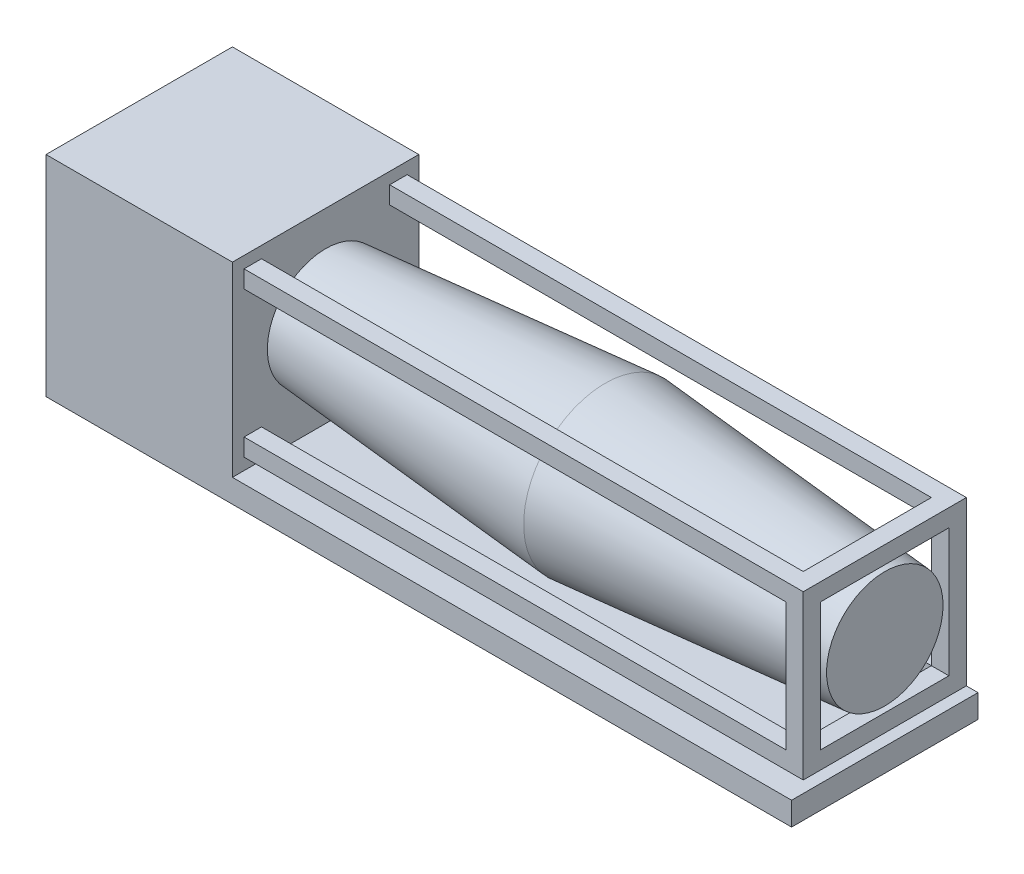
ISO-10303-21;
HEADER;
FILE_DESCRIPTION(('STEP AP214'),'2;1');
FILE_NAME('part.step','',(''),(''),'','','');
FILE_SCHEMA(('AUTOMOTIVE_DESIGN { 1 0 10303 214 1 1 1 1 }'));
ENDSEC;
DATA;
#1=APPLICATION_CONTEXT('core data for automotive mechanical design processes');
#2=APPLICATION_PROTOCOL_DEFINITION('international standard','automotive_design',2000,#1);
#3=PRODUCT_CONTEXT('',#1,'mechanical');
#4=PRODUCT('Part','Part','',(#3));
#5=PRODUCT_RELATED_PRODUCT_CATEGORY('part','',(#4));
#6=PRODUCT_DEFINITION_FORMATION('','',#4);
#7=PRODUCT_DEFINITION_CONTEXT('part definition',#1,'design');
#8=PRODUCT_DEFINITION('design','',#6,#7);
#9=PRODUCT_DEFINITION_SHAPE('','',#8);
#10=(LENGTH_UNIT() NAMED_UNIT(*) SI_UNIT(.MILLI.,.METRE.));
#11=(NAMED_UNIT(*) PLANE_ANGLE_UNIT() SI_UNIT($,.RADIAN.));
#12=(NAMED_UNIT(*) SI_UNIT($,.STERADIAN.) SOLID_ANGLE_UNIT());
#13=UNCERTAINTY_MEASURE_WITH_UNIT(LENGTH_MEASURE(1.E-05),#10,'distance_accuracy_value','');
#14=(GEOMETRIC_REPRESENTATION_CONTEXT(3) GLOBAL_UNCERTAINTY_ASSIGNED_CONTEXT((#13)) GLOBAL_UNIT_ASSIGNED_CONTEXT((#10,
#11,#12)) REPRESENTATION_CONTEXT('',''));
#15=CARTESIAN_POINT('',(0.,0.,0.));
#16=DIRECTION('',(0.,0.,1.));
#17=DIRECTION('',(1.,0.,0.));
#18=AXIS2_PLACEMENT_3D('',#15,#16,#17);
#19=CARTESIAN_POINT('',(661.213203435596,155.,-10.));
#20=DIRECTION('',(0.,1.,0.));
#21=DIRECTION('',(0.,0.,1.));
#22=AXIS2_PLACEMENT_3D('',#19,#20,#21);
#23=PLANE('',#22);
#24=DIRECTION('',(0.,0.,1.));
#25=VECTOR('',#24,1.);
#26=CARTESIAN_POINT('',(625.,155.,-135.));
#27=LINE('',#26,#25);
#28=CARTESIAN_POINT('',(625.,155.,-150.));
#29=VERTEX_POINT('',#28);
#30=CARTESIAN_POINT('',(625.,155.,-135.));
#31=VERTEX_POINT('',#30);
#32=EDGE_CURVE('E67',#29,#31,#27,.T.);
#33=ORIENTED_EDGE('',*,*,#32,.T.);
#34=DIRECTION('',(-1.,0.,0.));
#35=VECTOR('',#34,1.);
#36=CARTESIAN_POINT('',(661.213203435596,155.,-135.));
#37=LINE('',#36,#35);
#38=CARTESIAN_POINT('',(160.,155.,-135.));
#39=VERTEX_POINT('',#38);
#40=EDGE_CURVE('E364',#31,#39,#37,.T.);
#41=ORIENTED_EDGE('',*,*,#40,.T.);
#42=DIRECTION('',(0.,0.,-1.));
#43=VECTOR('',#42,1.);
#44=CARTESIAN_POINT('',(160.,155.,-150.));
#45=LINE('',#44,#43);
#46=CARTESIAN_POINT('',(160.,155.,-150.));
#47=VERTEX_POINT('',#46);
#48=EDGE_CURVE('E370',#39,#47,#45,.T.);
#49=ORIENTED_EDGE('',*,*,#48,.T.);
#50=DIRECTION('',(-1.,0.,0.));
#51=VECTOR('',#50,1.);
#52=CARTESIAN_POINT('',(661.213203435596,155.,-150.));
#53=LINE('',#52,#51);
#54=EDGE_CURVE('E367',#29,#47,#53,.T.);
#55=ORIENTED_EDGE('',*,*,#54,.F.);
#56=EDGE_LOOP('',(#33,#41,#49,#55));
#57=FACE_BOUND('',#56,.T.);
#58=ADVANCED_FACE('F43',(#57),#23,.F.);
#59=DIRECTION('',(1.,0.,0.));
#60=VECTOR('',#59,1.);
#61=CARTESIAN_POINT('',(625.,155.,-135.));
#62=LINE('',#61,#60);
#63=CARTESIAN_POINT('',(640.,155.,-135.));
#64=VERTEX_POINT('',#63);
#65=EDGE_CURVE('E247',#31,#64,#62,.T.);
#66=ORIENTED_EDGE('',*,*,#65,.T.);
#67=DIRECTION('',(0.,0.,1.));
#68=VECTOR('',#67,1.);
#69=CARTESIAN_POINT('',(640.,155.,-10.));
#70=LINE('',#69,#68);
#71=CARTESIAN_POINT('',(640.,155.,-25.));
#72=VERTEX_POINT('',#71);
#73=EDGE_CURVE('E394',#64,#72,#70,.T.);
#74=ORIENTED_EDGE('',*,*,#73,.T.);
#75=DIRECTION('',(-1.,0.,0.));
#76=VECTOR('',#75,1.);
#77=CARTESIAN_POINT('',(640.,155.,-25.));
#78=LINE('',#77,#76);
#79=CARTESIAN_POINT('',(625.,155.,-25.));
#80=VERTEX_POINT('',#79);
#81=EDGE_CURVE('E266',#72,#80,#78,.T.);
#82=ORIENTED_EDGE('',*,*,#81,.T.);
#83=DIRECTION('',(0.,0.,1.));
#84=VECTOR('',#83,1.);
#85=CARTESIAN_POINT('',(625.,155.,-156.213203435596));
#86=LINE('',#85,#84);
#87=EDGE_CURVE('E285',#31,#80,#86,.T.);
#88=ORIENTED_EDGE('',*,*,#87,.F.);
#89=EDGE_LOOP('',(#66,#74,#82,#88));
#90=FACE_BOUND('',#89,.T.);
#91=ADVANCED_FACE('F539',(#90),#23,.F.);
#92=CARTESIAN_POINT('',(661.213203435596,45.,-150.));
#93=DIRECTION('',(0.,-1.,0.));
#94=DIRECTION('',(0.,0.,-1.));
#95=AXIS2_PLACEMENT_3D('',#92,#93,#94);
#96=PLANE('',#95);
#97=DIRECTION('',(0.,0.,1.));
#98=VECTOR('',#97,1.);
#99=CARTESIAN_POINT('',(625.,45.,-135.));
#100=LINE('',#99,#98);
#101=CARTESIAN_POINT('',(625.,45.,-150.));
#102=VERTEX_POINT('',#101);
#103=CARTESIAN_POINT('',(625.,45.,-135.));
#104=VERTEX_POINT('',#103);
#105=EDGE_CURVE('E224',#102,#104,#100,.T.);
#106=ORIENTED_EDGE('',*,*,#105,.F.);
#107=DIRECTION('',(-1.,0.,0.));
#108=VECTOR('',#107,1.);
#109=CARTESIAN_POINT('',(661.213203435596,45.,-150.));
#110=LINE('',#109,#108);
#111=CARTESIAN_POINT('',(160.,45.,-150.));
#112=VERTEX_POINT('',#111);
#113=EDGE_CURVE('E207',#102,#112,#110,.T.);
#114=ORIENTED_EDGE('',*,*,#113,.T.);
#115=DIRECTION('',(0.,0.,1.));
#116=VECTOR('',#115,1.);
#117=CARTESIAN_POINT('',(160.,45.,-150.));
#118=LINE('',#117,#116);
#119=CARTESIAN_POINT('',(160.,45.,-135.));
#120=VERTEX_POINT('',#119);
#121=EDGE_CURVE('E343',#112,#120,#118,.T.);
#122=ORIENTED_EDGE('',*,*,#121,.T.);
#123=DIRECTION('',(-1.,0.,0.));
#124=VECTOR('',#123,1.);
#125=CARTESIAN_POINT('',(661.213203435596,45.,-135.));
#126=LINE('',#125,#124);
#127=EDGE_CURVE('E219',#104,#120,#126,.T.);
#128=ORIENTED_EDGE('',*,*,#127,.F.);
#129=EDGE_LOOP('',(#106,#114,#122,#128));
#130=FACE_BOUND('',#129,.T.);
#131=ADVANCED_FACE('F225',(#130),#96,.F.);
#132=DIRECTION('',(1.,0.,0.));
#133=VECTOR('',#132,1.);
#134=CARTESIAN_POINT('',(625.,45.,-135.));
#135=LINE('',#134,#133);
#136=CARTESIAN_POINT('',(640.,45.,-135.));
#137=VERTEX_POINT('',#136);
#138=EDGE_CURVE('E241',#104,#137,#135,.T.);
#139=ORIENTED_EDGE('',*,*,#138,.F.);
#140=DIRECTION('',(0.,0.,1.));
#141=VECTOR('',#140,1.);
#142=CARTESIAN_POINT('',(625.,45.,-156.213203435596));
#143=LINE('',#142,#141);
#144=CARTESIAN_POINT('',(625.,45.,-25.));
#145=VERTEX_POINT('',#144);
#146=EDGE_CURVE('E276',#104,#145,#143,.T.);
#147=ORIENTED_EDGE('',*,*,#146,.T.);
#148=DIRECTION('',(-1.,0.,0.));
#149=VECTOR('',#148,1.);
#150=CARTESIAN_POINT('',(640.,45.,-25.));
#151=LINE('',#150,#149);
#152=CARTESIAN_POINT('',(640.,45.,-25.));
#153=VERTEX_POINT('',#152);
#154=EDGE_CURVE('E235',#153,#145,#151,.T.);
#155=ORIENTED_EDGE('',*,*,#154,.F.);
#156=DIRECTION('',(0.,0.,-1.));
#157=VECTOR('',#156,1.);
#158=CARTESIAN_POINT('',(640.,45.,-150.));
#159=LINE('',#158,#157);
#160=EDGE_CURVE('E59',#153,#137,#159,.T.);
#161=ORIENTED_EDGE('',*,*,#160,.T.);
#162=EDGE_LOOP('',(#139,#147,#155,#161));
#163=FACE_BOUND('',#162,.T.);
#164=ADVANCED_FACE('F551',(#163),#96,.F.);
#165=DIRECTION('',(0.,0.,1.));
#166=VECTOR('',#165,1.);
#167=CARTESIAN_POINT('',(625.,155.,-10.));
#168=LINE('',#167,#166);
#169=CARTESIAN_POINT('',(625.,155.,-10.));
#170=VERTEX_POINT('',#169);
#171=EDGE_CURVE('E262',#80,#170,#168,.T.);
#172=ORIENTED_EDGE('',*,*,#171,.T.);
#173=DIRECTION('',(-1.,0.,0.));
#174=VECTOR('',#173,1.);
#175=CARTESIAN_POINT('',(661.213203435596,155.,-10.));
#176=LINE('',#175,#174);
#177=CARTESIAN_POINT('',(160.,155.,-10.));
#178=VERTEX_POINT('',#177);
#179=EDGE_CURVE('E416',#170,#178,#176,.T.);
#180=ORIENTED_EDGE('',*,*,#179,.T.);
#181=DIRECTION('',(0.,0.,-1.));
#182=VECTOR('',#181,1.);
#183=CARTESIAN_POINT('',(160.,155.,-10.));
#184=LINE('',#183,#182);
#185=CARTESIAN_POINT('',(160.,155.,-25.));
#186=VERTEX_POINT('',#185);
#187=EDGE_CURVE('E409',#178,#186,#184,.T.);
#188=ORIENTED_EDGE('',*,*,#187,.T.);
#189=DIRECTION('',(-1.,0.,0.));
#190=VECTOR('',#189,1.);
#191=CARTESIAN_POINT('',(661.213203435596,155.,-25.));
#192=LINE('',#191,#190);
#193=EDGE_CURVE('E413',#80,#186,#192,.T.);
#194=ORIENTED_EDGE('',*,*,#193,.F.);
#195=EDGE_LOOP('',(#172,#180,#188,#194));
#196=FACE_BOUND('',#195,.T.);
#197=ADVANCED_FACE('F542',(#196),#23,.F.);
#198=DIRECTION('',(0.,0.,1.));
#199=VECTOR('',#198,1.);
#200=CARTESIAN_POINT('',(625.,45.,-10.));
#201=LINE('',#200,#199);
#202=CARTESIAN_POINT('',(625.,45.,-10.));
#203=VERTEX_POINT('',#202);
#204=EDGE_CURVE('E254',#145,#203,#201,.T.);
#205=ORIENTED_EDGE('',*,*,#204,.F.);
#206=DIRECTION('',(-1.,0.,0.));
#207=VECTOR('',#206,1.);
#208=CARTESIAN_POINT('',(661.213203435596,45.,-25.));
#209=LINE('',#208,#207);
#210=CARTESIAN_POINT('',(160.,45.,-25.));
#211=VERTEX_POINT('',#210);
#212=EDGE_CURVE('E309',#145,#211,#209,.T.);
#213=ORIENTED_EDGE('',*,*,#212,.T.);
#214=DIRECTION('',(0.,0.,1.));
#215=VECTOR('',#214,1.);
#216=CARTESIAN_POINT('',(160.,45.,-10.));
#217=LINE('',#216,#215);
#218=CARTESIAN_POINT('',(160.,45.,-10.));
#219=VERTEX_POINT('',#218);
#220=EDGE_CURVE('E315',#211,#219,#217,.T.);
#221=ORIENTED_EDGE('',*,*,#220,.T.);
#222=DIRECTION('',(-1.,0.,0.));
#223=VECTOR('',#222,1.);
#224=CARTESIAN_POINT('',(661.213203435596,45.,-10.));
#225=LINE('',#224,#223);
#226=EDGE_CURVE('E312',#203,#219,#225,.T.);
#227=ORIENTED_EDGE('',*,*,#226,.F.);
#228=EDGE_LOOP('',(#205,#213,#221,#227));
#229=FACE_BOUND('',#228,.T.);
#230=ADVANCED_FACE('F550',(#229),#96,.F.);
#231=CARTESIAN_POINT('',(661.213203435596,170.,-25.));
#232=DIRECTION('',(0.,0.,1.));
#233=DIRECTION('',(0.,-1.,0.));
#234=AXIS2_PLACEMENT_3D('',#231,#232,#233);
#235=PLANE('',#234);
#236=DIRECTION('',(0.,1.,0.));
#237=VECTOR('',#236,1.);
#238=CARTESIAN_POINT('',(625.,170.,-25.));
#239=LINE('',#238,#237);
#240=CARTESIAN_POINT('',(625.,170.,-25.));
#241=VERTEX_POINT('',#240);
#242=EDGE_CURVE('E289',#80,#241,#239,.T.);
#243=ORIENTED_EDGE('',*,*,#242,.F.);
#244=ORIENTED_EDGE('',*,*,#193,.T.);
#245=DIRECTION('',(0.,1.,0.));
#246=VECTOR('',#245,1.);
#247=CARTESIAN_POINT('',(160.,170.,-25.));
#248=LINE('',#247,#246);
#249=CARTESIAN_POINT('',(160.,170.,-25.));
#250=VERTEX_POINT('',#249);
#251=EDGE_CURVE('E386',#186,#250,#248,.T.);
#252=ORIENTED_EDGE('',*,*,#251,.T.);
#253=DIRECTION('',(-1.,0.,0.));
#254=VECTOR('',#253,1.);
#255=CARTESIAN_POINT('',(661.213203435596,170.,-25.));
#256=LINE('',#255,#254);
#257=EDGE_CURVE('E422',#241,#250,#256,.T.);
#258=ORIENTED_EDGE('',*,*,#257,.F.);
#259=EDGE_LOOP('',(#243,#244,#252,#258));
#260=FACE_BOUND('',#259,.T.);
#261=ADVANCED_FACE('F557',(#260),#235,.F.);
#262=CARTESIAN_POINT('',(661.213203435596,170.,-135.));
#263=DIRECTION('',(0.,0.,-1.));
#264=DIRECTION('',(-1.,0.,0.));
#265=AXIS2_PLACEMENT_3D('',#262,#263,#264);
#266=PLANE('',#265);
#267=DIRECTION('',(0.,1.,0.));
#268=VECTOR('',#267,1.);
#269=CARTESIAN_POINT('',(625.,170.,-135.));
#270=LINE('',#269,#268);
#271=CARTESIAN_POINT('',(625.,170.,-135.));
#272=VERTEX_POINT('',#271);
#273=EDGE_CURVE('E294',#31,#272,#270,.T.);
#274=ORIENTED_EDGE('',*,*,#273,.T.);
#275=DIRECTION('',(-1.,0.,0.));
#276=VECTOR('',#275,1.);
#277=CARTESIAN_POINT('',(661.213203435596,170.,-135.));
#278=LINE('',#277,#276);
#279=CARTESIAN_POINT('',(160.,170.,-135.));
#280=VERTEX_POINT('',#279);
#281=EDGE_CURVE('E361',#272,#280,#278,.T.);
#282=ORIENTED_EDGE('',*,*,#281,.T.);
#283=DIRECTION('',(0.,-1.,0.));
#284=VECTOR('',#283,1.);
#285=CARTESIAN_POINT('',(160.,170.,-135.));
#286=LINE('',#285,#284);
#287=EDGE_CURVE('E374',#280,#39,#286,.T.);
#288=ORIENTED_EDGE('',*,*,#287,.T.);
#289=ORIENTED_EDGE('',*,*,#40,.F.);
#290=EDGE_LOOP('',(#274,#282,#288,#289));
#291=FACE_BOUND('',#290,.T.);
#292=ADVANCED_FACE('F624',(#291),#266,.F.);
#293=CARTESIAN_POINT('',(160.,0.,0.));
#294=DIRECTION('',(1.,0.,0.));
#295=DIRECTION('',(0.,0.,-1.));
#296=AXIS2_PLACEMENT_3D('',#293,#294,#295);
#297=PLANE('',#296);
#298=DIRECTION('',(0.,-1.,0.));
#299=VECTOR('',#298,1.);
#300=CARTESIAN_POINT('',(160.,180.,0.));
#301=LINE('',#300,#299);
#302=CARTESIAN_POINT('',(160.,180.,0.));
#303=VERTEX_POINT('',#302);
#304=CARTESIAN_POINT('',(160.,20.,0.));
#305=VERTEX_POINT('',#304);
#306=EDGE_CURVE('E439',#303,#305,#301,.T.);
#307=ORIENTED_EDGE('',*,*,#306,.T.);
#308=DIRECTION('',(0.,0.,-1.));
#309=VECTOR('',#308,1.);
#310=CARTESIAN_POINT('',(160.,20.,0.));
#311=LINE('',#310,#309);
#312=CARTESIAN_POINT('',(160.,20.,-160.));
#313=VERTEX_POINT('',#312);
#314=EDGE_CURVE('E443',#305,#313,#311,.T.);
#315=ORIENTED_EDGE('',*,*,#314,.T.);
#316=DIRECTION('',(0.,1.,0.));
#317=VECTOR('',#316,1.);
#318=CARTESIAN_POINT('',(160.,180.,-160.));
#319=LINE('',#318,#317);
#320=CARTESIAN_POINT('',(160.,180.,-160.));
#321=VERTEX_POINT('',#320);
#322=EDGE_CURVE('E447',#313,#321,#319,.T.);
#323=ORIENTED_EDGE('',*,*,#322,.T.);
#324=DIRECTION('',(0.,0.,1.));
#325=VECTOR('',#324,1.);
#326=CARTESIAN_POINT('',(160.,180.,0.));
#327=LINE('',#326,#325);
#328=EDGE_CURVE('E450',#321,#303,#327,.T.);
#329=ORIENTED_EDGE('',*,*,#328,.T.);
#330=EDGE_LOOP('',(#307,#315,#323,#329));
#331=FACE_BOUND('',#330,.T.);
#332=CARTESIAN_POINT('',(160.,100.,-80.));
#333=DIRECTION('',(1.,0.,0.));
#334=DIRECTION('',(0.,0.,-1.));
#335=AXIS2_PLACEMENT_3D('',#332,#333,#334);
#336=CIRCLE('',#335,50.);
#337=CARTESIAN_POINT('',(160.,100.,-130.));
#338=VERTEX_POINT('',#337);
#339=EDGE_CURVE('E434',#338,#338,#336,.T.);
#340=ORIENTED_EDGE('',*,*,#339,.F.);
#341=EDGE_LOOP('',(#340));
#342=FACE_BOUND('',#341,.T.);
#343=ORIENTED_EDGE('',*,*,#251,.F.);
#344=ORIENTED_EDGE('',*,*,#187,.F.);
#345=DIRECTION('',(0.,-1.,0.));
#346=VECTOR('',#345,1.);
#347=CARTESIAN_POINT('',(160.,170.,-10.));
#348=LINE('',#347,#346);
#349=CARTESIAN_POINT('',(160.,170.,-10.));
#350=VERTEX_POINT('',#349);
#351=EDGE_CURVE('E405',#350,#178,#348,.T.);
#352=ORIENTED_EDGE('',*,*,#351,.F.);
#353=DIRECTION('',(0.,0.,1.));
#354=VECTOR('',#353,1.);
#355=CARTESIAN_POINT('',(160.,170.,-10.));
#356=LINE('',#355,#354);
#357=EDGE_CURVE('E401',#250,#350,#356,.T.);
#358=ORIENTED_EDGE('',*,*,#357,.F.);
#359=EDGE_LOOP('',(#343,#344,#352,#358));
#360=FACE_BOUND('',#359,.T.);
#361=DIRECTION('',(0.,1.,0.));
#362=VECTOR('',#361,1.);
#363=CARTESIAN_POINT('',(160.,170.,-150.));
#364=LINE('',#363,#362);
#365=CARTESIAN_POINT('',(160.,170.,-150.));
#366=VERTEX_POINT('',#365);
#367=EDGE_CURVE('E382',#47,#366,#364,.T.);
#368=ORIENTED_EDGE('',*,*,#367,.F.);
#369=ORIENTED_EDGE('',*,*,#48,.F.);
#370=ORIENTED_EDGE('',*,*,#287,.F.);
#371=DIRECTION('',(0.,0.,1.));
#372=VECTOR('',#371,1.);
#373=CARTESIAN_POINT('',(160.,170.,-150.));
#374=LINE('',#373,#372);
#375=EDGE_CURVE('E378',#366,#280,#374,.T.);
#376=ORIENTED_EDGE('',*,*,#375,.F.);
#377=EDGE_LOOP('',(#368,#369,#370,#376));
#378=FACE_BOUND('',#377,.T.);
#379=DIRECTION('',(0.,0.,-1.));
#380=VECTOR('',#379,1.);
#381=CARTESIAN_POINT('',(160.,30.,-150.));
#382=LINE('',#381,#380);
#383=CARTESIAN_POINT('',(160.,30.,-135.));
#384=VERTEX_POINT('',#383);
#385=CARTESIAN_POINT('',(160.,30.,-150.));
#386=VERTEX_POINT('',#385);
#387=EDGE_CURVE('E348',#384,#386,#382,.T.);
#388=ORIENTED_EDGE('',*,*,#387,.F.);
#389=DIRECTION('',(0.,-1.,0.));
#390=VECTOR('',#389,1.);
#391=CARTESIAN_POINT('',(160.,30.,-135.));
#392=LINE('',#391,#390);
#393=EDGE_CURVE('E339',#120,#384,#392,.T.);
#394=ORIENTED_EDGE('',*,*,#393,.F.);
#395=ORIENTED_EDGE('',*,*,#121,.F.);
#396=DIRECTION('',(0.,1.,0.));
#397=VECTOR('',#396,1.);
#398=CARTESIAN_POINT('',(160.,30.,-150.));
#399=LINE('',#398,#397);
#400=EDGE_CURVE('E214',#386,#112,#399,.T.);
#401=ORIENTED_EDGE('',*,*,#400,.F.);
#402=EDGE_LOOP('',(#388,#394,#395,#401));
#403=FACE_BOUND('',#402,.T.);
#404=DIRECTION('',(0.,-1.,0.));
#405=VECTOR('',#404,1.);
#406=CARTESIAN_POINT('',(160.,30.,-10.));
#407=LINE('',#406,#405);
#408=CARTESIAN_POINT('',(160.,30.,-10.));
#409=VERTEX_POINT('',#408);
#410=EDGE_CURVE('E327',#219,#409,#407,.T.);
#411=ORIENTED_EDGE('',*,*,#410,.F.);
#412=ORIENTED_EDGE('',*,*,#220,.F.);
#413=DIRECTION('',(0.,1.,0.));
#414=VECTOR('',#413,1.);
#415=CARTESIAN_POINT('',(160.,30.,-25.));
#416=LINE('',#415,#414);
#417=CARTESIAN_POINT('',(160.,30.,-25.));
#418=VERTEX_POINT('',#417);
#419=EDGE_CURVE('E319',#418,#211,#416,.T.);
#420=ORIENTED_EDGE('',*,*,#419,.F.);
#421=DIRECTION('',(0.,0.,-1.));
#422=VECTOR('',#421,1.);
#423=CARTESIAN_POINT('',(160.,30.,-10.));
#424=LINE('',#423,#422);
#425=EDGE_CURVE('E323',#409,#418,#424,.T.);
#426=ORIENTED_EDGE('',*,*,#425,.F.);
#427=EDGE_LOOP('',(#411,#412,#420,#426));
#428=FACE_BOUND('',#427,.T.);
#429=ADVANCED_FACE('F520',(#331,#342,#360,#378,#403,#428),#297,.T.);
#430=CARTESIAN_POINT('',(0.,180.,0.));
#431=DIRECTION('',(0.,-1.,0.));
#432=DIRECTION('',(0.,0.,-1.));
#433=AXIS2_PLACEMENT_3D('',#430,#431,#432);
#434=PLANE('',#433);
#435=ORIENTED_EDGE('',*,*,#328,.F.);
#436=DIRECTION('',(-1.,0.,0.));
#437=VECTOR('',#436,1.);
#438=CARTESIAN_POINT('',(0.,180.,-160.));
#439=LINE('',#438,#437);
#440=CARTESIAN_POINT('',(0.,180.,-160.));
#441=VERTEX_POINT('',#440);
#442=EDGE_CURVE('E472',#321,#441,#439,.T.);
#443=ORIENTED_EDGE('',*,*,#442,.T.);
#444=DIRECTION('',(0.,0.,1.));
#445=VECTOR('',#444,1.);
#446=CARTESIAN_POINT('',(0.,180.,0.));
#447=LINE('',#446,#445);
#448=CARTESIAN_POINT('',(0.,180.,0.));
#449=VERTEX_POINT('',#448);
#450=EDGE_CURVE('E463',#441,#449,#447,.T.);
#451=ORIENTED_EDGE('',*,*,#450,.T.);
#452=DIRECTION('',(1.,0.,0.));
#453=VECTOR('',#452,1.);
#454=CARTESIAN_POINT('',(0.,180.,0.));
#455=LINE('',#454,#453);
#456=EDGE_CURVE('E467',#449,#303,#455,.T.);
#457=ORIENTED_EDGE('',*,*,#456,.T.);
#458=EDGE_LOOP('',(#435,#443,#451,#457));
#459=FACE_BOUND('',#458,.T.);
#460=ADVANCED_FACE('F518',(#459),#434,.F.);
#461=CARTESIAN_POINT('',(0.,180.,0.));
#462=DIRECTION('',(1.,0.,0.));
#463=DIRECTION('',(0.,0.,-1.));
#464=AXIS2_PLACEMENT_3D('',#461,#462,#463);
#465=PLANE('',#464);
#466=DIRECTION('',(0.,0.,1.));
#467=VECTOR('',#466,1.);
#468=CARTESIAN_POINT('',(0.,0.,0.));
#469=LINE('',#468,#467);
#470=CARTESIAN_POINT('',(0.,0.,-160.));
#471=VERTEX_POINT('',#470);
#472=CARTESIAN_POINT('',(0.,0.,0.));
#473=VERTEX_POINT('',#472);
#474=EDGE_CURVE('E460',#471,#473,#469,.T.);
#475=ORIENTED_EDGE('',*,*,#474,.T.);
#476=DIRECTION('',(0.,-1.,0.));
#477=VECTOR('',#476,1.);
#478=CARTESIAN_POINT('',(0.,180.,0.));
#479=LINE('',#478,#477);
#480=EDGE_CURVE('E11',#449,#473,#479,.T.);
#481=ORIENTED_EDGE('',*,*,#480,.F.);
#482=ORIENTED_EDGE('',*,*,#450,.F.);
#483=DIRECTION('',(0.,-1.,0.));
#484=VECTOR('',#483,1.);
#485=CARTESIAN_POINT('',(0.,180.,-160.));
#486=LINE('',#485,#484);
#487=EDGE_CURVE('E475',#441,#471,#486,.T.);
#488=ORIENTED_EDGE('',*,*,#487,.T.);
#489=EDGE_LOOP('',(#475,#481,#482,#488));
#490=FACE_BOUND('',#489,.T.);
#491=ADVANCED_FACE('F45',(#490),#465,.F.);
#492=CARTESIAN_POINT('',(0.,180.,0.));
#493=DIRECTION('',(0.,0.,-1.));
#494=DIRECTION('',(-1.,0.,0.));
#495=AXIS2_PLACEMENT_3D('',#492,#493,#494);
#496=PLANE('',#495);
#497=DIRECTION('',(0.,-1.,0.));
#498=VECTOR('',#497,1.);
#499=CARTESIAN_POINT('',(640.,180.,0.));
#500=LINE('',#499,#498);
#501=CARTESIAN_POINT('',(640.,20.,0.));
#502=VERTEX_POINT('',#501);
#503=CARTESIAN_POINT('',(640.,0.,0.));
#504=VERTEX_POINT('',#503);
#505=EDGE_CURVE('E52',#502,#504,#500,.T.);
#506=ORIENTED_EDGE('',*,*,#505,.F.);
#507=DIRECTION('',(1.,0.,0.));
#508=VECTOR('',#507,1.);
#509=CARTESIAN_POINT('',(160.,20.,0.));
#510=LINE('',#509,#508);
#511=EDGE_CURVE('E453',#305,#502,#510,.T.);
#512=ORIENTED_EDGE('',*,*,#511,.F.);
#513=ORIENTED_EDGE('',*,*,#306,.F.);
#514=ORIENTED_EDGE('',*,*,#456,.F.);
#515=ORIENTED_EDGE('',*,*,#480,.T.);
#516=DIRECTION('',(1.,0.,0.));
#517=VECTOR('',#516,1.);
#518=CARTESIAN_POINT('',(0.,0.,0.));
#519=LINE('',#518,#517);
#520=EDGE_CURVE('E479',#473,#504,#519,.T.);
#521=ORIENTED_EDGE('',*,*,#520,.T.);
#522=EDGE_LOOP('',(#506,#512,#513,#514,#515,#521));
#523=FACE_BOUND('',#522,.T.);
#524=ADVANCED_FACE('F504',(#523),#496,.F.);
#525=CARTESIAN_POINT('',(640.,180.,0.));
#526=DIRECTION('',(-1.,0.,0.));
#527=DIRECTION('',(0.,0.,1.));
#528=AXIS2_PLACEMENT_3D('',#525,#526,#527);
#529=PLANE('',#528);
#530=DIRECTION('',(0.,-1.,0.));
#531=VECTOR('',#530,1.);
#532=CARTESIAN_POINT('',(640.,180.,-160.));
#533=LINE('',#532,#531);
#534=CARTESIAN_POINT('',(640.,20.,-160.));
#535=VERTEX_POINT('',#534);
#536=CARTESIAN_POINT('',(640.,0.,-160.));
#537=VERTEX_POINT('',#536);
#538=EDGE_CURVE('E492',#535,#537,#533,.T.);
#539=ORIENTED_EDGE('',*,*,#538,.F.);
#540=DIRECTION('',(0.,0.,-1.));
#541=VECTOR('',#540,1.);
#542=CARTESIAN_POINT('',(640.,20.,0.));
#543=LINE('',#542,#541);
#544=EDGE_CURVE('E438',#502,#535,#543,.T.);
#545=ORIENTED_EDGE('',*,*,#544,.F.);
#546=ORIENTED_EDGE('',*,*,#505,.T.);
#547=DIRECTION('',(0.,0.,-1.));
#548=VECTOR('',#547,1.);
#549=CARTESIAN_POINT('',(640.,0.,0.));
#550=LINE('',#549,#548);
#551=EDGE_CURVE('E483',#504,#537,#550,.T.);
#552=ORIENTED_EDGE('',*,*,#551,.T.);
#553=EDGE_LOOP('',(#539,#545,#546,#552));
#554=FACE_BOUND('',#553,.T.);
#555=ADVANCED_FACE('F499',(#554),#529,.F.);
#556=CARTESIAN_POINT('',(0.,180.,-160.));
#557=DIRECTION('',(0.,0.,1.));
#558=DIRECTION('',(1.,0.,0.));
#559=AXIS2_PLACEMENT_3D('',#556,#557,#558);
#560=PLANE('',#559);
#561=ORIENTED_EDGE('',*,*,#322,.F.);
#562=DIRECTION('',(1.,0.,0.));
#563=VECTOR('',#562,1.);
#564=CARTESIAN_POINT('',(160.,20.,-160.));
#565=LINE('',#564,#563);
#566=EDGE_CURVE('E456',#313,#535,#565,.T.);
#567=ORIENTED_EDGE('',*,*,#566,.T.);
#568=ORIENTED_EDGE('',*,*,#538,.T.);
#569=DIRECTION('',(-1.,0.,0.));
#570=VECTOR('',#569,1.);
#571=CARTESIAN_POINT('',(0.,0.,-160.));
#572=LINE('',#571,#570);
#573=EDGE_CURVE('E468',#537,#471,#572,.T.);
#574=ORIENTED_EDGE('',*,*,#573,.T.);
#575=ORIENTED_EDGE('',*,*,#487,.F.);
#576=ORIENTED_EDGE('',*,*,#442,.F.);
#577=EDGE_LOOP('',(#561,#567,#568,#574,#575,#576));
#578=FACE_BOUND('',#577,.T.);
#579=ADVANCED_FACE('F512',(#578),#560,.F.);
#580=CARTESIAN_POINT('',(0.,0.,0.));
#581=DIRECTION('',(0.,-1.,0.));
#582=DIRECTION('',(0.,0.,-1.));
#583=AXIS2_PLACEMENT_3D('',#580,#581,#582);
#584=PLANE('',#583);
#585=ORIENTED_EDGE('',*,*,#474,.F.);
#586=ORIENTED_EDGE('',*,*,#573,.F.);
#587=ORIENTED_EDGE('',*,*,#551,.F.);
#588=ORIENTED_EDGE('',*,*,#520,.F.);
#589=EDGE_LOOP('',(#585,#586,#587,#588));
#590=FACE_BOUND('',#589,.T.);
#591=ADVANCED_FACE('F508',(#590),#584,.T.);
#592=CARTESIAN_POINT('',(160.,20.,0.));
#593=DIRECTION('',(0.,-1.,0.));
#594=DIRECTION('',(0.,0.,-1.));
#595=AXIS2_PLACEMENT_3D('',#592,#593,#594);
#596=PLANE('',#595);
#597=ORIENTED_EDGE('',*,*,#544,.T.);
#598=ORIENTED_EDGE('',*,*,#566,.F.);
#599=ORIENTED_EDGE('',*,*,#314,.F.);
#600=ORIENTED_EDGE('',*,*,#511,.T.);
#601=EDGE_LOOP('',(#597,#598,#599,#600));
#602=FACE_BOUND('',#601,.T.);
#603=ADVANCED_FACE('F524',(#602),#596,.F.);
#604=CARTESIAN_POINT('',(160.,100.,-80.));
#605=DIRECTION('',(1.,0.,0.));
#606=DIRECTION('',(0.,0.,-1.));
#607=AXIS2_PLACEMENT_3D('',#604,#605,#606);
#608=CONICAL_SURFACE('',#607,50.,0.0831412318884412);
#609=CARTESIAN_POINT('',(400.,100.,-80.));
#610=DIRECTION('',(1.,0.,0.));
#611=DIRECTION('',(0.,0.,-1.));
#612=AXIS2_PLACEMENT_3D('',#609,#610,#611);
#613=CIRCLE('',#612,70.);
#614=CARTESIAN_POINT('',(400.,100.,-150.));
#615=VERTEX_POINT('',#614);
#616=EDGE_CURVE('E397',#615,#615,#613,.T.);
#617=ORIENTED_EDGE('',*,*,#616,.F.);
#618=EDGE_LOOP('',(#617));
#619=FACE_BOUND('',#618,.T.);
#620=ORIENTED_EDGE('',*,*,#339,.T.);
#621=EDGE_LOOP('',(#620));
#622=FACE_BOUND('',#621,.T.);
#623=ADVANCED_FACE('F526',(#619,#622),#608,.T.);
#624=CARTESIAN_POINT('',(640.,100.,-80.));
#625=DIRECTION('',(-1.,0.,0.));
#626=DIRECTION('',(0.,0.,1.));
#627=AXIS2_PLACEMENT_3D('',#624,#625,#626);
#628=CONICAL_SURFACE('',#627,50.,0.0831412318884412);
#629=ORIENTED_EDGE('',*,*,#616,.T.);
#630=EDGE_LOOP('',(#629));
#631=FACE_BOUND('',#630,.T.);
#632=CARTESIAN_POINT('',(640.,100.,-80.));
#633=DIRECTION('',(1.,0.,0.));
#634=DIRECTION('',(0.,0.,-1.));
#635=AXIS2_PLACEMENT_3D('',#632,#633,#634);
#636=CIRCLE('',#635,50.);
#637=CARTESIAN_POINT('',(640.,100.,-130.));
#638=VERTEX_POINT('',#637);
#639=EDGE_CURVE('E430',#638,#638,#636,.T.);
#640=ORIENTED_EDGE('',*,*,#639,.F.);
#641=EDGE_LOOP('',(#640));
#642=FACE_BOUND('',#641,.T.);
#643=ADVANCED_FACE('F532',(#631,#642),#628,.T.);
#644=CARTESIAN_POINT('',(640.,180.,0.));
#645=DIRECTION('',(-1.,0.,0.));
#646=DIRECTION('',(0.,0.,1.));
#647=AXIS2_PLACEMENT_3D('',#644,#645,#646);
#648=PLANE('',#647);
#649=ORIENTED_EDGE('',*,*,#639,.T.);
#650=EDGE_LOOP('',(#649));
#651=FACE_BOUND('',#650,.T.);
#652=ADVANCED_FACE('F649',(#651),#648,.F.);
#653=CARTESIAN_POINT('',(661.213203435596,170.,-10.));
#654=DIRECTION('',(0.,0.,-1.));
#655=DIRECTION('',(0.,1.,0.));
#656=AXIS2_PLACEMENT_3D('',#653,#654,#655);
#657=PLANE('',#656);
#658=ORIENTED_EDGE('',*,*,#179,.F.);
#659=DIRECTION('',(0.,-1.,0.));
#660=VECTOR('',#659,1.);
#661=CARTESIAN_POINT('',(625.,176.213203435596,-10.));
#662=LINE('',#661,#660);
#663=EDGE_CURVE('E257',#170,#203,#662,.T.);
#664=ORIENTED_EDGE('',*,*,#663,.T.);
#665=ORIENTED_EDGE('',*,*,#226,.T.);
#666=ORIENTED_EDGE('',*,*,#410,.T.);
#667=DIRECTION('',(-1.,0.,0.));
#668=VECTOR('',#667,1.);
#669=CARTESIAN_POINT('',(661.213203435596,30.,-10.));
#670=LINE('',#669,#668);
#671=CARTESIAN_POINT('',(640.,30.,-10.));
#672=VERTEX_POINT('',#671);
#673=EDGE_CURVE('E297',#672,#409,#670,.T.);
#674=ORIENTED_EDGE('',*,*,#673,.F.);
#675=DIRECTION('',(0.,1.,0.));
#676=VECTOR('',#675,1.);
#677=CARTESIAN_POINT('',(640.,170.,-10.));
#678=LINE('',#677,#676);
#679=CARTESIAN_POINT('',(640.,170.,-10.));
#680=VERTEX_POINT('',#679);
#681=EDGE_CURVE('E389',#672,#680,#678,.T.);
#682=ORIENTED_EDGE('',*,*,#681,.T.);
#683=DIRECTION('',(-1.,0.,0.));
#684=VECTOR('',#683,1.);
#685=CARTESIAN_POINT('',(661.213203435596,170.,-10.));
#686=LINE('',#685,#684);
#687=EDGE_CURVE('E419',#680,#350,#686,.T.);
#688=ORIENTED_EDGE('',*,*,#687,.T.);
#689=ORIENTED_EDGE('',*,*,#351,.T.);
#690=EDGE_LOOP('',(#658,#664,#665,#666,#674,#682,#688,#689));
#691=FACE_BOUND('',#690,.T.);
#692=ADVANCED_FACE('F567',(#691),#657,.F.);
#693=CARTESIAN_POINT('',(661.213203435596,170.,-10.));
#694=DIRECTION('',(0.,-1.,0.));
#695=DIRECTION('',(0.,0.,-1.));
#696=AXIS2_PLACEMENT_3D('',#693,#694,#695);
#697=PLANE('',#696);
#698=ORIENTED_EDGE('',*,*,#687,.F.);
#699=DIRECTION('',(0.,0.,-1.));
#700=VECTOR('',#699,1.);
#701=CARTESIAN_POINT('',(640.,170.,-10.));
#702=LINE('',#701,#700);
#703=CARTESIAN_POINT('',(640.,170.,-150.));
#704=VERTEX_POINT('',#703);
#705=EDGE_CURVE('E393',#680,#704,#702,.T.);
#706=ORIENTED_EDGE('',*,*,#705,.T.);
#707=DIRECTION('',(-1.,0.,0.));
#708=VECTOR('',#707,1.);
#709=CARTESIAN_POINT('',(661.213203435596,170.,-150.));
#710=LINE('',#709,#708);
#711=EDGE_CURVE('E358',#704,#366,#710,.T.);
#712=ORIENTED_EDGE('',*,*,#711,.T.);
#713=ORIENTED_EDGE('',*,*,#375,.T.);
#714=ORIENTED_EDGE('',*,*,#281,.F.);
#715=DIRECTION('',(0.,0.,1.));
#716=VECTOR('',#715,1.);
#717=CARTESIAN_POINT('',(625.,170.,-156.213203435596));
#718=LINE('',#717,#716);
#719=EDGE_CURVE('E293',#272,#241,#718,.T.);
#720=ORIENTED_EDGE('',*,*,#719,.T.);
#721=ORIENTED_EDGE('',*,*,#257,.T.);
#722=ORIENTED_EDGE('',*,*,#357,.T.);
#723=EDGE_LOOP('',(#698,#706,#712,#713,#714,#720,#721,#722));
#724=FACE_BOUND('',#723,.T.);
#725=ADVANCED_FACE('F601',(#724),#697,.F.);
#726=CARTESIAN_POINT('',(640.,180.,0.));
#727=DIRECTION('',(-1.,0.,0.));
#728=DIRECTION('',(0.,0.,1.));
#729=AXIS2_PLACEMENT_3D('',#726,#727,#728);
#730=PLANE('',#729);
#731=DIRECTION('',(0.,0.,1.));
#732=VECTOR('',#731,1.);
#733=CARTESIAN_POINT('',(640.,30.,-150.));
#734=LINE('',#733,#732);
#735=CARTESIAN_POINT('',(640.,30.,-150.));
#736=VERTEX_POINT('',#735);
#737=EDGE_CURVE('E331',#736,#672,#734,.T.);
#738=ORIENTED_EDGE('',*,*,#737,.F.);
#739=DIRECTION('',(0.,-1.,0.));
#740=VECTOR('',#739,1.);
#741=CARTESIAN_POINT('',(640.,170.,-150.));
#742=LINE('',#741,#740);
#743=EDGE_CURVE('E352',#704,#736,#742,.T.);
#744=ORIENTED_EDGE('',*,*,#743,.F.);
#745=ORIENTED_EDGE('',*,*,#705,.F.);
#746=ORIENTED_EDGE('',*,*,#681,.F.);
#747=EDGE_LOOP('',(#738,#744,#745,#746));
#748=FACE_BOUND('',#747,.T.);
#749=DIRECTION('',(0.,-1.,0.));
#750=VECTOR('',#749,1.);
#751=CARTESIAN_POINT('',(640.,176.213203435596,-135.));
#752=LINE('',#751,#750);
#753=EDGE_CURVE('E238',#64,#137,#752,.T.);
#754=ORIENTED_EDGE('',*,*,#753,.T.);
#755=ORIENTED_EDGE('',*,*,#160,.F.);
#756=DIRECTION('',(0.,-1.,0.));
#757=VECTOR('',#756,1.);
#758=CARTESIAN_POINT('',(640.,176.213203435596,-25.));
#759=LINE('',#758,#757);
#760=EDGE_CURVE('E232',#72,#153,#759,.T.);
#761=ORIENTED_EDGE('',*,*,#760,.F.);
#762=ORIENTED_EDGE('',*,*,#73,.F.);
#763=EDGE_LOOP('',(#754,#755,#761,#762));
#764=FACE_BOUND('',#763,.T.);
#765=ADVANCED_FACE('F594',(#748,#764),#730,.F.);
#766=CARTESIAN_POINT('',(661.213203435596,170.,-150.));
#767=DIRECTION('',(0.,0.,1.));
#768=DIRECTION('',(1.,0.,0.));
#769=AXIS2_PLACEMENT_3D('',#766,#767,#768);
#770=PLANE('',#769);
#771=ORIENTED_EDGE('',*,*,#711,.F.);
#772=ORIENTED_EDGE('',*,*,#743,.T.);
#773=DIRECTION('',(-1.,0.,0.));
#774=VECTOR('',#773,1.);
#775=CARTESIAN_POINT('',(661.213203435596,30.,-150.));
#776=LINE('',#775,#774);
#777=EDGE_CURVE('E220',#736,#386,#776,.T.);
#778=ORIENTED_EDGE('',*,*,#777,.T.);
#779=ORIENTED_EDGE('',*,*,#400,.T.);
#780=ORIENTED_EDGE('',*,*,#113,.F.);
#781=DIRECTION('',(0.,-1.,0.));
#782=VECTOR('',#781,1.);
#783=CARTESIAN_POINT('',(625.,176.213203435596,-150.));
#784=LINE('',#783,#782);
#785=EDGE_CURVE('E211',#29,#102,#784,.T.);
#786=ORIENTED_EDGE('',*,*,#785,.F.);
#787=ORIENTED_EDGE('',*,*,#54,.T.);
#788=ORIENTED_EDGE('',*,*,#367,.T.);
#789=EDGE_LOOP('',(#771,#772,#778,#779,#780,#786,#787,#788));
#790=FACE_BOUND('',#789,.T.);
#791=ADVANCED_FACE('F210',(#790),#770,.F.);
#792=CARTESIAN_POINT('',(661.213203435596,30.,-135.));
#793=DIRECTION('',(0.,0.,-1.));
#794=DIRECTION('',(-1.,0.,0.));
#795=AXIS2_PLACEMENT_3D('',#792,#793,#794);
#796=PLANE('',#795);
#797=DIRECTION('',(-1.,0.,0.));
#798=VECTOR('',#797,1.);
#799=CARTESIAN_POINT('',(661.213203435596,30.,-135.));
#800=LINE('',#799,#798);
#801=CARTESIAN_POINT('',(625.,30.,-135.));
#802=VERTEX_POINT('',#801);
#803=EDGE_CURVE('E336',#802,#384,#800,.T.);
#804=ORIENTED_EDGE('',*,*,#803,.F.);
#805=DIRECTION('',(0.,-1.,0.));
#806=VECTOR('',#805,1.);
#807=CARTESIAN_POINT('',(625.,30.,-135.));
#808=LINE('',#807,#806);
#809=EDGE_CURVE('E277',#104,#802,#808,.T.);
#810=ORIENTED_EDGE('',*,*,#809,.F.);
#811=ORIENTED_EDGE('',*,*,#127,.T.);
#812=ORIENTED_EDGE('',*,*,#393,.T.);
#813=EDGE_LOOP('',(#804,#810,#811,#812));
#814=FACE_BOUND('',#813,.T.);
#815=ADVANCED_FACE('F630',(#814),#796,.F.);
#816=CARTESIAN_POINT('',(661.213203435596,30.,-150.));
#817=DIRECTION('',(0.,1.,0.));
#818=DIRECTION('',(0.,0.,1.));
#819=AXIS2_PLACEMENT_3D('',#816,#817,#818);
#820=PLANE('',#819);
#821=ORIENTED_EDGE('',*,*,#777,.F.);
#822=ORIENTED_EDGE('',*,*,#737,.T.);
#823=ORIENTED_EDGE('',*,*,#673,.T.);
#824=ORIENTED_EDGE('',*,*,#425,.T.);
#825=DIRECTION('',(-1.,0.,0.));
#826=VECTOR('',#825,1.);
#827=CARTESIAN_POINT('',(661.213203435596,30.,-25.));
#828=LINE('',#827,#826);
#829=CARTESIAN_POINT('',(625.,30.,-25.));
#830=VERTEX_POINT('',#829);
#831=EDGE_CURVE('E306',#830,#418,#828,.T.);
#832=ORIENTED_EDGE('',*,*,#831,.F.);
#833=DIRECTION('',(0.,0.,1.));
#834=VECTOR('',#833,1.);
#835=CARTESIAN_POINT('',(625.,30.,-156.213203435596));
#836=LINE('',#835,#834);
#837=EDGE_CURVE('E281',#802,#830,#836,.T.);
#838=ORIENTED_EDGE('',*,*,#837,.F.);
#839=ORIENTED_EDGE('',*,*,#803,.T.);
#840=ORIENTED_EDGE('',*,*,#387,.T.);
#841=EDGE_LOOP('',(#821,#822,#823,#824,#832,#838,#839,#840));
#842=FACE_BOUND('',#841,.T.);
#843=ADVANCED_FACE('F586',(#842),#820,.F.);
#844=CARTESIAN_POINT('',(661.213203435596,30.,-25.));
#845=DIRECTION('',(0.,0.,1.));
#846=DIRECTION('',(0.,-1.,0.));
#847=AXIS2_PLACEMENT_3D('',#844,#845,#846);
#848=PLANE('',#847);
#849=ORIENTED_EDGE('',*,*,#212,.F.);
#850=DIRECTION('',(0.,-1.,0.));
#851=VECTOR('',#850,1.);
#852=CARTESIAN_POINT('',(625.,30.,-25.));
#853=LINE('',#852,#851);
#854=EDGE_CURVE('E265',#145,#830,#853,.T.);
#855=ORIENTED_EDGE('',*,*,#854,.T.);
#856=ORIENTED_EDGE('',*,*,#831,.T.);
#857=ORIENTED_EDGE('',*,*,#419,.T.);
#858=EDGE_LOOP('',(#849,#855,#856,#857));
#859=FACE_BOUND('',#858,.T.);
#860=ADVANCED_FACE('F575',(#859),#848,.F.);
#861=CARTESIAN_POINT('',(625.,170.,-156.213203435596));
#862=DIRECTION('',(1.,0.,0.));
#863=DIRECTION('',(0.,0.,-1.));
#864=AXIS2_PLACEMENT_3D('',#861,#862,#863);
#865=PLANE('',#864);
#866=ORIENTED_EDGE('',*,*,#273,.F.);
#867=ORIENTED_EDGE('',*,*,#87,.T.);
#868=ORIENTED_EDGE('',*,*,#242,.T.);
#869=ORIENTED_EDGE('',*,*,#719,.F.);
#870=EDGE_LOOP('',(#866,#867,#868,#869));
#871=FACE_BOUND('',#870,.T.);
#872=ADVANCED_FACE('F613',(#871),#865,.F.);
#873=CARTESIAN_POINT('',(625.,30.,-156.213203435596));
#874=DIRECTION('',(-1.,0.,0.));
#875=DIRECTION('',(0.,0.,1.));
#876=AXIS2_PLACEMENT_3D('',#873,#874,#875);
#877=PLANE('',#876);
#878=ORIENTED_EDGE('',*,*,#146,.F.);
#879=ORIENTED_EDGE('',*,*,#809,.T.);
#880=ORIENTED_EDGE('',*,*,#837,.T.);
#881=ORIENTED_EDGE('',*,*,#854,.F.);
#882=EDGE_LOOP('',(#878,#879,#880,#881));
#883=FACE_BOUND('',#882,.T.);
#884=ADVANCED_FACE('F582',(#883),#877,.T.);
#885=CARTESIAN_POINT('',(640.,176.213203435596,-25.));
#886=DIRECTION('',(0.,0.,1.));
#887=DIRECTION('',(1.,0.,0.));
#888=AXIS2_PLACEMENT_3D('',#885,#886,#887);
#889=PLANE('',#888);
#890=ORIENTED_EDGE('',*,*,#81,.F.);
#891=ORIENTED_EDGE('',*,*,#760,.T.);
#892=ORIENTED_EDGE('',*,*,#154,.T.);
#893=DIRECTION('',(0.,-1.,0.));
#894=VECTOR('',#893,1.);
#895=CARTESIAN_POINT('',(625.,176.213203435596,-25.));
#896=LINE('',#895,#894);
#897=EDGE_CURVE('E258',#80,#145,#896,.T.);
#898=ORIENTED_EDGE('',*,*,#897,.F.);
#899=EDGE_LOOP('',(#890,#891,#892,#898));
#900=FACE_BOUND('',#899,.T.);
#901=ADVANCED_FACE('F619',(#900),#889,.F.);
#902=CARTESIAN_POINT('',(625.,176.213203435596,-10.));
#903=DIRECTION('',(1.,0.,0.));
#904=DIRECTION('',(0.,0.,-1.));
#905=AXIS2_PLACEMENT_3D('',#902,#903,#904);
#906=PLANE('',#905);
#907=ORIENTED_EDGE('',*,*,#171,.F.);
#908=ORIENTED_EDGE('',*,*,#897,.T.);
#909=ORIENTED_EDGE('',*,*,#204,.T.);
#910=ORIENTED_EDGE('',*,*,#663,.F.);
#911=EDGE_LOOP('',(#907,#908,#909,#910));
#912=FACE_BOUND('',#911,.T.);
#913=ADVANCED_FACE('F571',(#912),#906,.F.);
#914=CARTESIAN_POINT('',(625.,176.213203435596,-135.));
#915=DIRECTION('',(1.,0.,0.));
#916=DIRECTION('',(0.,0.,-1.));
#917=AXIS2_PLACEMENT_3D('',#914,#915,#916);
#918=PLANE('',#917);
#919=ORIENTED_EDGE('',*,*,#32,.F.);
#920=ORIENTED_EDGE('',*,*,#785,.T.);
#921=ORIENTED_EDGE('',*,*,#105,.T.);
#922=DIRECTION('',(0.,-1.,0.));
#923=VECTOR('',#922,1.);
#924=CARTESIAN_POINT('',(625.,176.213203435596,-135.));
#925=LINE('',#924,#923);
#926=EDGE_CURVE('E228',#31,#104,#925,.T.);
#927=ORIENTED_EDGE('',*,*,#926,.F.);
#928=EDGE_LOOP('',(#919,#920,#921,#927));
#929=FACE_BOUND('',#928,.T.);
#930=ADVANCED_FACE('F230',(#929),#918,.F.);
#931=CARTESIAN_POINT('',(625.,176.213203435596,-135.));
#932=DIRECTION('',(0.,0.,-1.));
#933=DIRECTION('',(-1.,0.,0.));
#934=AXIS2_PLACEMENT_3D('',#931,#932,#933);
#935=PLANE('',#934);
#936=ORIENTED_EDGE('',*,*,#65,.F.);
#937=ORIENTED_EDGE('',*,*,#926,.T.);
#938=ORIENTED_EDGE('',*,*,#138,.T.);
#939=ORIENTED_EDGE('',*,*,#753,.F.);
#940=EDGE_LOOP('',(#936,#937,#938,#939));
#941=FACE_BOUND('',#940,.T.);
#942=ADVANCED_FACE('F621',(#941),#935,.F.);
#943=CLOSED_SHELL('',(#58,#91,#131,#164,#197,#230,#261,#292,#429,#460,#491,#524,#555,#579,#591,
#603,#623,#643,#652,#692,#725,#765,#791,#815,#843,#860,#872,#884,#901,#913,#930,#942));
#944=MANIFOLD_SOLID_BREP('B2',#943);
#945=ADVANCED_BREP_SHAPE_REPRESENTATION('',(#18,#944),#14);
#946=SHAPE_DEFINITION_REPRESENTATION(#9,#945);
ENDSEC;
END-ISO-10303-21;
